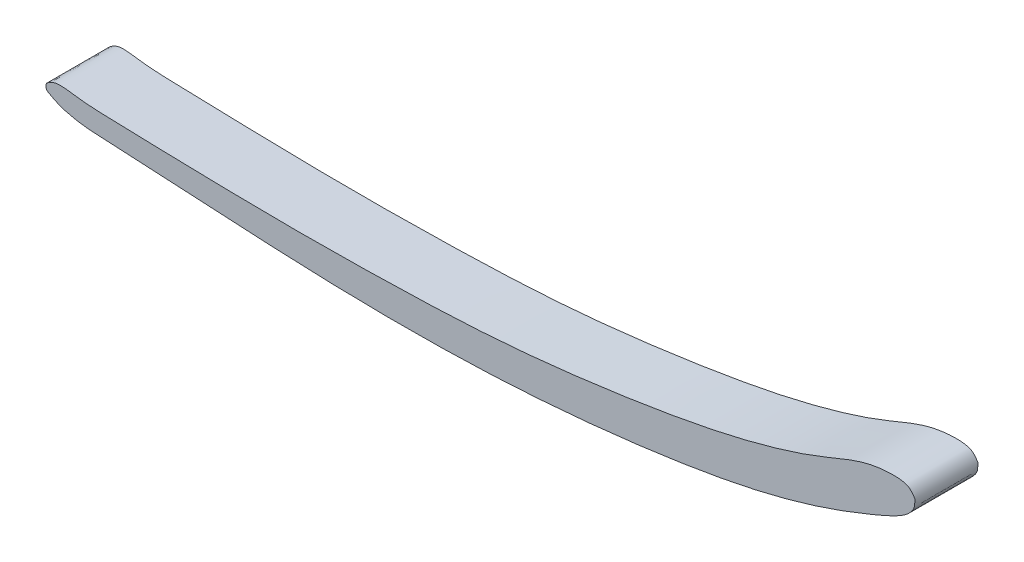
ISO-10303-21;
HEADER;
FILE_DESCRIPTION(('STEP AP214'),'2;1');
FILE_NAME('part.step','',(''),(''),'','','');
FILE_SCHEMA(('AUTOMOTIVE_DESIGN { 1 0 10303 214 1 1 1 1 }'));
ENDSEC;
DATA;
#1=APPLICATION_CONTEXT('core data for automotive mechanical design processes');
#2=APPLICATION_PROTOCOL_DEFINITION('international standard','automotive_design',2000,#1);
#3=PRODUCT_CONTEXT('',#1,'mechanical');
#4=PRODUCT('Part','Part','',(#3));
#5=PRODUCT_RELATED_PRODUCT_CATEGORY('part','',(#4));
#6=PRODUCT_DEFINITION_FORMATION('','',#4);
#7=PRODUCT_DEFINITION_CONTEXT('part definition',#1,'design');
#8=PRODUCT_DEFINITION('design','',#6,#7);
#9=PRODUCT_DEFINITION_SHAPE('','',#8);
#10=(LENGTH_UNIT() NAMED_UNIT(*) SI_UNIT(.MILLI.,.METRE.));
#11=(NAMED_UNIT(*) PLANE_ANGLE_UNIT() SI_UNIT($,.RADIAN.));
#12=(NAMED_UNIT(*) SI_UNIT($,.STERADIAN.) SOLID_ANGLE_UNIT());
#13=UNCERTAINTY_MEASURE_WITH_UNIT(LENGTH_MEASURE(1.E-05),#10,'distance_accuracy_value','');
#14=(GEOMETRIC_REPRESENTATION_CONTEXT(3) GLOBAL_UNCERTAINTY_ASSIGNED_CONTEXT((#13)) GLOBAL_UNIT_ASSIGNED_CONTEXT((#10,
#11,#12)) REPRESENTATION_CONTEXT('',''));
#15=CARTESIAN_POINT('',(0.,0.,0.));
#16=DIRECTION('',(0.,0.,1.));
#17=DIRECTION('',(1.,0.,0.));
#18=AXIS2_PLACEMENT_3D('',#15,#16,#17);
#19=CARTESIAN_POINT('',(44.0644998100804,0.,468.));
#20=CARTESIAN_POINT('',(44.0487426110995,0.0747795698248371,468.));
#21=CARTESIAN_POINT('',(44.0066285616688,0.138285887827466,468.));
#22=CARTESIAN_POINT('',(43.9174798611695,0.259771016666507,468.));
#23=CARTESIAN_POINT('',(43.8693396593438,0.317704629409471,468.));
#24=CARTESIAN_POINT('',(43.728705510161,0.494488197718357,468.));
#25=CARTESIAN_POINT('',(43.6355314167215,0.614036978815527,468.));
#26=CARTESIAN_POINT('',(43.4776854036437,0.773364463677331,468.));
#27=CARTESIAN_POINT('',(43.4224494251973,0.823355589215966,468.));
#28=CARTESIAN_POINT('',(43.3028584150423,0.912487998679615,468.));
#29=CARTESIAN_POINT('',(43.2383813507814,0.952187287814169,468.));
#30=CARTESIAN_POINT('',(43.036491469862,1.05648348796587,468.));
#31=CARTESIAN_POINT('',(42.8949440843003,1.10489769444441,468.));
#32=CARTESIAN_POINT('',(42.6051946924935,1.18151899478794,468.));
#33=CARTESIAN_POINT('',(42.4563249647608,1.20911279913936,468.));
#34=CARTESIAN_POINT('',(42.1599701086323,1.25263575074508,468.));
#35=CARTESIAN_POINT('',(42.0116678309176,1.26825994903046,468.));
#36=CARTESIAN_POINT('',(41.5664336996111,1.29904343475046,468.));
#37=CARTESIAN_POINT('',(41.2692052946623,1.29962504440216,468.));
#38=CARTESIAN_POINT('',(40.3769537596533,1.27353107694493,468.));
#39=CARTESIAN_POINT('',(39.7793953379146,1.21326251019017,468.));
#40=CARTESIAN_POINT('',(38.6093345703275,1.02800174316137,468.));
#41=CARTESIAN_POINT('',(38.033877553265,0.900526481156141,468.));
#42=CARTESIAN_POINT('',(36.3342386903471,0.420801607137103,468.));
#43=CARTESIAN_POINT('',(35.2343480996498,-0.0204449536766182,468.));
#44=CARTESIAN_POINT('',(33.0397157547789,-0.91902635895362,468.));
#45=CARTESIAN_POINT('',(31.941817983729,-1.36653330914031,468.));
#46=CARTESIAN_POINT('',(29.7194733442159,-2.18012160701367,468.));
#47=CARTESIAN_POINT('',(28.5963648598515,-2.55030775457044,468.));
#48=CARTESIAN_POINT('',(26.334191646651,-3.24174253593278,468.));
#49=CARTESIAN_POINT('',(25.1951322618297,-3.56300755973495,468.));
#50=CARTESIAN_POINT('',(22.9049128626524,-4.16842519499815,468.));
#51=CARTESIAN_POINT('',(21.7528308604324,-4.4517038220054,468.));
#52=CARTESIAN_POINT('',(19.441266107108,-4.98035279634867,468.));
#53=CARTESIAN_POINT('',(18.2815119485901,-5.2261292514405,468.));
#54=CARTESIAN_POINT('',(14.7928225700587,-5.9194354288372,468.));
#55=CARTESIAN_POINT('',(12.4559665401192,-6.32497870535333,468.));
#56=CARTESIAN_POINT('',(7.77368696752906,-7.06949517634928,468.));
#57=CARTESIAN_POINT('',(5.42689105443257,-7.40552729274606,468.));
#58=CARTESIAN_POINT('',(0.723827305647878,-8.01692616071034,468.));
#59=CARTESIAN_POINT('',(-1.63103770718041,-8.29207792652546,468.));
#60=CARTESIAN_POINT('',(-6.34870595525171,-8.75984581041182,468.));
#61=CARTESIAN_POINT('',(-8.7121917654114,-8.95173173202739,468.));
#62=CARTESIAN_POINT('',(-13.4455415840817,-9.2505778596734,468.));
#63=CARTESIAN_POINT('',(-15.8139411499019,-9.35849633448876,468.));
#64=CARTESIAN_POINT('',(-20.5527711504375,-9.52545956372952,468.));
#65=CARTESIAN_POINT('',(-22.9233067662587,-9.58612766573032,468.));
#66=CARTESIAN_POINT('',(-27.6646911517423,-9.67727732300758,468.));
#67=CARTESIAN_POINT('',(-30.0355398040244,-9.70636359756674,468.));
#68=CARTESIAN_POINT('',(-34.7776012275624,-9.72616331640817,468.));
#69=CARTESIAN_POINT('',(-37.1489474895554,-9.71485439545976,468.));
#70=CARTESIAN_POINT('',(-41.8910401710544,-9.65628801843245,468.));
#71=CARTESIAN_POINT('',(-44.2618828820648,-9.60941579762635,468.));
#72=CARTESIAN_POINT('',(-49.003169415494,-9.50055554065823,468.));
#73=CARTESIAN_POINT('',(-51.3736681314817,-9.4399019462786,468.));
#74=CARTESIAN_POINT('',(-54.9292293004791,-9.34226904286155,468.));
#75=CARTESIAN_POINT('',(-56.1143760307127,-9.3081641940089,468.));
#76=CARTESIAN_POINT('',(-57.8919124120678,-9.25120870961037,468.));
#77=CARTESIAN_POINT('',(-58.4844769231578,-9.23383337513604,468.));
#78=CARTESIAN_POINT('',(-59.6693025708144,-9.18975961592779,468.));
#79=CARTESIAN_POINT('',(-60.261368540667,-9.1623658838923,468.));
#80=CARTESIAN_POINT('',(-61.4424121592727,-9.07472662624309,468.));
#81=CARTESIAN_POINT('',(-62.0312424161992,-9.01215760276729,468.));
#82=CARTESIAN_POINT('',(-62.9120040645428,-8.89077399119345,468.));
#83=CARTESIAN_POINT('',(-63.2052490654777,-8.84538030283788,468.));
#84=CARTESIAN_POINT('',(-63.7930483140101,-8.77582879977123,468.));
#85=CARTESIAN_POINT('',(-64.0873647970197,-8.74877982399833,468.));
#86=CARTESIAN_POINT('',(-64.6788990580981,-8.74845945706004,468.));
#87=CARTESIAN_POINT('',(-64.9801997791766,-8.77849470570007,468.));
#88=CARTESIAN_POINT('',(-65.3976771033837,-8.925670090988,468.));
#89=CARTESIAN_POINT('',(-65.5328364388672,-8.99117678064817,468.));
#90=CARTESIAN_POINT('',(-65.7291426050438,-9.09918990449302,468.));
#91=CARTESIAN_POINT('',(-65.7933724927479,-9.13733044947888,468.));
#92=CARTESIAN_POINT('',(-65.9206201421513,-9.21575944941545,468.));
#93=CARTESIAN_POINT('',(-65.9856460833711,-9.2529717847841,468.));
#94=CARTESIAN_POINT('',(-66.074863422471,-9.32109150036592,468.));
#95=CARTESIAN_POINT('',(-66.1026083662393,-9.34647422907237,468.));
#96=CARTESIAN_POINT('',(-66.1484221414977,-9.40481990969558,468.));
#97=CARTESIAN_POINT('',(-66.167159046373,-9.43798284004486,468.));
#98=CARTESIAN_POINT('',(-66.2088132969872,-9.54135023052961,468.));
#99=CARTESIAN_POINT('',(-66.2156651510359,-9.61733383106155,468.));
#100=CARTESIAN_POINT('',(-66.2107615171826,-9.76585735092438,468.));
#101=CARTESIAN_POINT('',(-66.2050718671693,-9.84037523842224,468.));
#102=CARTESIAN_POINT('',(-66.1807072701507,-9.98723272681659,468.));
#103=CARTESIAN_POINT('',(-66.1601257950063,-10.0607991888009,468.));
#104=CARTESIAN_POINT('',(-66.0793201734134,-10.1856961165474,468.));
#105=CARTESIAN_POINT('',(-66.0170726552108,-10.2305771423296,468.));
#106=CARTESIAN_POINT('',(-65.888800740335,-10.3017982432044,468.));
#107=CARTESIAN_POINT('',(-65.8213839416174,-10.3313729613084,468.));
#108=CARTESIAN_POINT('',(-65.6237594448957,-10.4286074795716,468.));
#109=CARTESIAN_POINT('',(-65.4953569436119,-10.4998263598811,468.));
#110=CARTESIAN_POINT('',(-65.2381862950858,-10.6422594866561,468.));
#111=CARTESIAN_POINT('',(-65.1095860122687,-10.7134428846287,468.));
#112=CARTESIAN_POINT('',(-64.846459335005,-10.8426705797111,468.));
#113=CARTESIAN_POINT('',(-64.712261855566,-10.9014441319764,468.));
#114=CARTESIAN_POINT('',(-64.3034957414497,-11.0640768000721,468.));
#115=CARTESIAN_POINT('',(-64.0223781539809,-11.1550521074748,468.));
#116=CARTESIAN_POINT('',(-63.1730985507133,-11.3996615053087,468.));
#117=CARTESIAN_POINT('',(-62.5959128417318,-11.5222449558475,468.));
#118=CARTESIAN_POINT('',(-61.4323686414119,-11.70477149075,468.));
#119=CARTESIAN_POINT('',(-60.8484402188233,-11.7657324686755,468.));
#120=CARTESIAN_POINT('',(-59.6788127267434,-11.8627719420278,468.));
#121=CARTESIAN_POINT('',(-59.0930490284576,-11.897942224278,468.));
#122=CARTESIAN_POINT('',(-57.3347133821027,-11.9887742356761,468.));
#123=CARTESIAN_POINT('',(-56.1613588489297,-12.033353064341,468.));
#124=CARTESIAN_POINT('',(-53.81554554101,-12.1354506914092,468.));
#125=CARTESIAN_POINT('',(-52.6428559320847,-12.1907703526045,468.));
#126=CARTESIAN_POINT('',(-49.1255823407132,-12.3723773756695,468.));
#127=CARTESIAN_POINT('',(-46.7815967097742,-12.5104214073786,468.));
#128=CARTESIAN_POINT('',(-42.093316174935,-12.7803722092456,468.));
#129=CARTESIAN_POINT('',(-39.7488668148183,-12.9093878563781,468.));
#130=CARTESIAN_POINT('',(-35.0581422317833,-13.1322138776901,468.));
#131=CARTESIAN_POINT('',(-32.711704686276,-13.2272005070115,468.));
#132=CARTESIAN_POINT('',(-28.0181934424292,-13.3680667852679,468.));
#133=CARTESIAN_POINT('',(-25.6710023360616,-13.4143485234218,468.));
#134=CARTESIAN_POINT('',(-18.6279495251887,-13.4711430482395,468.));
#135=CARTESIAN_POINT('',(-13.9310592084294,-13.3960026998435,468.));
#136=CARTESIAN_POINT('',(-6.89620119401808,-13.0653513837359,468.));
#137=CARTESIAN_POINT('',(-4.5519084242352,-12.9169010107629,468.));
#138=CARTESIAN_POINT('',(0.129380000783136,-12.5513379467449,468.));
#139=CARTESIAN_POINT('',(2.46672003829808,-12.3341029576614,468.));
#140=CARTESIAN_POINT('',(7.13460455537941,-11.828774001234,468.));
#141=CARTESIAN_POINT('',(9.46623197321021,-11.5429036821514,468.));
#142=CARTESIAN_POINT('',(14.1161937681737,-10.8939622181808,468.));
#143=CARTESIAN_POINT('',(16.4350946329209,-10.5328539414953,468.));
#144=CARTESIAN_POINT('',(21.0544395176363,-9.69941866527703,468.));
#145=CARTESIAN_POINT('',(23.3572213856599,-9.22631232236966,468.));
#146=CARTESIAN_POINT('',(27.9196732280383,-8.11317220995275,468.));
#147=CARTESIAN_POINT('',(30.181288228683,-7.47103725833653,468.));
#148=CARTESIAN_POINT('',(34.6403757700239,-5.99263668056362,468.));
#149=CARTESIAN_POINT('',(36.8382836012823,-5.15648057027124,468.));
#150=CARTESIAN_POINT('',(39.5466722234027,-4.02015176182585,468.));
#151=CARTESIAN_POINT('',(40.0865160543014,-3.78839939866528,468.));
#152=CARTESIAN_POINT('',(40.8881445287564,-3.42243310524981,468.));
#153=CARTESIAN_POINT('',(41.1535725721356,-3.29684727771964,468.));
#154=CARTESIAN_POINT('',(41.6781754043687,-3.033049180848,468.));
#155=CARTESIAN_POINT('',(41.9382991947852,-2.8950787501591,468.));
#156=CARTESIAN_POINT('',(42.4428637720376,-2.59670619542955,468.));
#157=CARTESIAN_POINT('',(42.6871175776959,-2.43654590744033,468.));
#158=CARTESIAN_POINT('',(43.0332218728056,-2.16858995600915,468.));
#159=CARTESIAN_POINT('',(43.1451075862784,-2.07451128685697,468.));
#160=CARTESIAN_POINT('',(43.3594659160693,-1.87348732996533,468.));
#161=CARTESIAN_POINT('',(43.4622438782328,-1.76588074499226,468.));
#162=CARTESIAN_POINT('',(43.6524470584674,-1.54034888322031,468.));
#163=CARTESIAN_POINT('',(43.7403607821456,-1.42207640564945,468.));
#164=CARTESIAN_POINT('',(43.8911371023551,-1.16634005312835,468.));
#165=CARTESIAN_POINT('',(43.9525297856029,-1.03201294871684,468.));
#166=CARTESIAN_POINT('',(44.0234137328401,-0.74607381967709,468.));
#167=CARTESIAN_POINT('',(44.0303835377685,-0.594926739972731,468.));
#168=CARTESIAN_POINT('',(44.0436056617194,-0.371858371836675,468.));
#169=CARTESIAN_POINT('',(44.0513004781616,-0.297725948045904,468.));
#170=CARTESIAN_POINT('',(44.0684380761984,-0.149580043382072,468.));
#171=CARTESIAN_POINT('',(44.0802570090613,-0.0747795698248233,468.));
#172=CARTESIAN_POINT('',(44.0644998100804,0.,468.));
#173=B_SPLINE_CURVE_WITH_KNOTS('',3,(#19,#20,#21,#22,#23,#24,#25,#26,#27,#28,#29,#30,#31,#32,
#33,#34,#35,#36,#37,#38,#39,#40,#41,#42,#43,#44,#45,#46,#47,#48,#49,#50,#51,#52,#53,#54,#55,#56,
#57,#58,#59,#60,#61,#62,#63,#64,#65,#66,#67,#68,#69,#70,#71,#72,#73,#74,#75,#76,#77,#78,#79,#80,
#81,#82,#83,#84,#85,#86,#87,#88,#89,#90,#91,#92,#93,#94,#95,#96,#97,#98,#99,#100,#101,#102,#103,
#104,#105,#106,#107,#108,#109,#110,#111,#112,#113,#114,#115,#116,#117,#118,#119,#120,#121,#122,
#123,#124,#125,#126,#127,#128,#129,#130,#131,#132,#133,#134,#135,#136,#137,#138,#139,#140,#141,
#142,#143,#144,#145,#146,#147,#148,#149,#150,#151,#152,#153,#154,#155,#156,#157,#158,#159,#160,
#161,#162,#163,#164,#165,#166,#167,#168,#169,#170,#171,#172),.UNSPECIFIED.,.T.,.F.,(4,2,2,2,2,2,
2,2,2,2,2,2,2,2,2,2,2,2,2,2,2,2,2,2,2,2,2,2,2,2,2,2,2,2,2,2,2,2,2,2,2,2,2,2,2,2,2,2,2,2,2,2,2,2,
2,2,2,2,2,2,2,2,2,2,2,2,2,2,2,2,2,2,2,2,2,2,4),(0.,0.000976562500000071,0.00195312500000014,
0.00390625000000023,0.00488281250000027,0.00585937500000031,0.0078125000000004,
0.00976562500000049,0.0117187500000006,0.0156250000000007,0.0234375000000011,0.0312500000000014,
0.0468750000000021,0.0625000000000028,0.0781250000000035,0.0937500000000042,0.109375000000005,
0.125000000000006,0.156250000000007,0.187500000000008,0.21875000000001,0.250000000000011,
0.281250000000013,0.312500000000014,0.343750000000015,0.375000000000017,0.406250000000018,
0.43750000000002,0.45312500000002,0.460937500000021,0.468750000000021,0.476562500000021,
0.480468750000021,0.484375000000022,0.488281250000022,0.490234375000022,0.491210937500022,
0.492187500000022,0.492675781250022,0.493164062500022,0.494140625000021,0.495117187500021,
0.496093750000021,0.497070312500021,0.498046875000021,0.500000000000021,0.501953125000021,
0.503906250000021,0.507812500000021,0.51562500000002,0.52343750000002,0.53125000000002,
0.546875000000019,0.562500000000019,0.593750000000017,0.625000000000016,0.656250000000014,
0.687500000000013,0.75000000000001,0.781250000000009,0.812500000000008,0.843750000000007,
0.875000000000005,0.906250000000004,0.937500000000003,0.968750000000001,0.976562500000001,
0.980468750000001,0.984375000000001,0.988281250000001,0.990234375000001,0.9921875,0.994140625,
0.99609375,0.998046875,0.9990234375,1.),.UNSPECIFIED.);
#174=DIRECTION('',(0.,0.,-1.));
#175=VECTOR('',#174,1.);
#176=SURFACE_OF_LINEAR_EXTRUSION('',#173,#175);
#177=CARTESIAN_POINT('',(44.0644998100804,0.,468.));
#178=CARTESIAN_POINT('',(44.0802570090613,-0.0747795698248233,468.));
#179=CARTESIAN_POINT('',(44.0684380761984,-0.149580043382072,468.));
#180=CARTESIAN_POINT('',(44.0513004781616,-0.297725948045904,468.));
#181=CARTESIAN_POINT('',(44.0436056617194,-0.371858371836675,468.));
#182=CARTESIAN_POINT('',(44.0303835377685,-0.594926739972731,468.));
#183=CARTESIAN_POINT('',(44.0234137328401,-0.74607381967709,468.));
#184=CARTESIAN_POINT('',(43.9525297856029,-1.03201294871684,468.));
#185=CARTESIAN_POINT('',(43.8911371023551,-1.16634005312835,468.));
#186=CARTESIAN_POINT('',(43.7403607821456,-1.42207640564945,468.));
#187=CARTESIAN_POINT('',(43.6524470584674,-1.54034888322031,468.));
#188=CARTESIAN_POINT('',(43.4622438782328,-1.76588074499226,468.));
#189=CARTESIAN_POINT('',(43.3594659160693,-1.87348732996533,468.));
#190=CARTESIAN_POINT('',(43.1451075862784,-2.07451128685697,468.));
#191=CARTESIAN_POINT('',(43.0332218728056,-2.16858995600915,468.));
#192=CARTESIAN_POINT('',(42.6871175776959,-2.43654590744033,468.));
#193=CARTESIAN_POINT('',(42.4428637720376,-2.59670619542955,468.));
#194=CARTESIAN_POINT('',(41.9382991947852,-2.8950787501591,468.));
#195=CARTESIAN_POINT('',(41.6781754043687,-3.033049180848,468.));
#196=CARTESIAN_POINT('',(41.1535725721356,-3.29684727771964,468.));
#197=CARTESIAN_POINT('',(40.8881445287564,-3.42243310524981,468.));
#198=CARTESIAN_POINT('',(40.0865160543014,-3.78839939866528,468.));
#199=CARTESIAN_POINT('',(39.5466722234027,-4.02015176182585,468.));
#200=CARTESIAN_POINT('',(36.8382836012823,-5.15648057027124,468.));
#201=CARTESIAN_POINT('',(34.6403757700239,-5.99263668056362,468.));
#202=CARTESIAN_POINT('',(30.181288228683,-7.47103725833653,468.));
#203=CARTESIAN_POINT('',(27.9196732280383,-8.11317220995275,468.));
#204=CARTESIAN_POINT('',(23.3572213856599,-9.22631232236966,468.));
#205=CARTESIAN_POINT('',(21.0544395176363,-9.69941866527703,468.));
#206=CARTESIAN_POINT('',(16.4350946329209,-10.5328539414953,468.));
#207=CARTESIAN_POINT('',(14.1161937681737,-10.8939622181808,468.));
#208=CARTESIAN_POINT('',(9.46623197321021,-11.5429036821514,468.));
#209=CARTESIAN_POINT('',(7.13460455537941,-11.828774001234,468.));
#210=CARTESIAN_POINT('',(2.46672003829808,-12.3341029576614,468.));
#211=CARTESIAN_POINT('',(0.129380000783136,-12.5513379467449,468.));
#212=CARTESIAN_POINT('',(-4.5519084242352,-12.9169010107629,468.));
#213=CARTESIAN_POINT('',(-6.89620119401808,-13.0653513837359,468.));
#214=CARTESIAN_POINT('',(-13.9310592084294,-13.3960026998435,468.));
#215=CARTESIAN_POINT('',(-18.6279495251887,-13.4711430482395,468.));
#216=CARTESIAN_POINT('',(-25.6710023360616,-13.4143485234218,468.));
#217=CARTESIAN_POINT('',(-28.0181934424292,-13.3680667852679,468.));
#218=CARTESIAN_POINT('',(-32.711704686276,-13.2272005070115,468.));
#219=CARTESIAN_POINT('',(-35.0581422317833,-13.1322138776901,468.));
#220=CARTESIAN_POINT('',(-39.7488668148183,-12.9093878563781,468.));
#221=CARTESIAN_POINT('',(-42.093316174935,-12.7803722092456,468.));
#222=CARTESIAN_POINT('',(-46.7815967097742,-12.5104214073786,468.));
#223=CARTESIAN_POINT('',(-49.1255823407132,-12.3723773756695,468.));
#224=CARTESIAN_POINT('',(-52.6428559320847,-12.1907703526045,468.));
#225=CARTESIAN_POINT('',(-53.81554554101,-12.1354506914092,468.));
#226=CARTESIAN_POINT('',(-56.1613588489297,-12.033353064341,468.));
#227=CARTESIAN_POINT('',(-57.3347133821027,-11.9887742356761,468.));
#228=CARTESIAN_POINT('',(-59.0930490284576,-11.897942224278,468.));
#229=CARTESIAN_POINT('',(-59.6788127267434,-11.8627719420278,468.));
#230=CARTESIAN_POINT('',(-60.8484402188233,-11.7657324686755,468.));
#231=CARTESIAN_POINT('',(-61.4323686414119,-11.70477149075,468.));
#232=CARTESIAN_POINT('',(-62.5959128417318,-11.5222449558475,468.));
#233=CARTESIAN_POINT('',(-63.1730985507133,-11.3996615053087,468.));
#234=CARTESIAN_POINT('',(-64.0223781539809,-11.1550521074748,468.));
#235=CARTESIAN_POINT('',(-64.3034957414497,-11.0640768000721,468.));
#236=CARTESIAN_POINT('',(-64.712261855566,-10.9014441319764,468.));
#237=CARTESIAN_POINT('',(-64.846459335005,-10.8426705797111,468.));
#238=CARTESIAN_POINT('',(-65.1095860122687,-10.7134428846287,468.));
#239=CARTESIAN_POINT('',(-65.2381862950858,-10.6422594866561,468.));
#240=CARTESIAN_POINT('',(-65.4953569436119,-10.4998263598811,468.));
#241=CARTESIAN_POINT('',(-65.6237594448957,-10.4286074795716,468.));
#242=CARTESIAN_POINT('',(-65.8213839416174,-10.3313729613084,468.));
#243=CARTESIAN_POINT('',(-65.888800740335,-10.3017982432044,468.));
#244=CARTESIAN_POINT('',(-66.0170726552108,-10.2305771423296,468.));
#245=CARTESIAN_POINT('',(-66.0793201734134,-10.1856961165474,468.));
#246=CARTESIAN_POINT('',(-66.1601257950063,-10.0607991888009,468.));
#247=CARTESIAN_POINT('',(-66.1807072701507,-9.98723272681659,468.));
#248=CARTESIAN_POINT('',(-66.2050718671693,-9.84037523842224,468.));
#249=CARTESIAN_POINT('',(-66.2107615171826,-9.76585735092438,468.));
#250=CARTESIAN_POINT('',(-66.2156651510359,-9.61733383106155,468.));
#251=CARTESIAN_POINT('',(-66.2088132969872,-9.54135023052961,468.));
#252=CARTESIAN_POINT('',(-66.167159046373,-9.43798284004486,468.));
#253=CARTESIAN_POINT('',(-66.1484221414977,-9.40481990969558,468.));
#254=CARTESIAN_POINT('',(-66.1026083662393,-9.34647422907237,468.));
#255=CARTESIAN_POINT('',(-66.074863422471,-9.32109150036592,468.));
#256=CARTESIAN_POINT('',(-65.9856460833711,-9.2529717847841,468.));
#257=CARTESIAN_POINT('',(-65.9206201421513,-9.21575944941545,468.));
#258=CARTESIAN_POINT('',(-65.7933724927479,-9.13733044947888,468.));
#259=CARTESIAN_POINT('',(-65.7291426050438,-9.09918990449302,468.));
#260=CARTESIAN_POINT('',(-65.5328364388672,-8.99117678064817,468.));
#261=CARTESIAN_POINT('',(-65.3976771033837,-8.925670090988,468.));
#262=CARTESIAN_POINT('',(-64.9801997791766,-8.77849470570007,468.));
#263=CARTESIAN_POINT('',(-64.6788990580981,-8.74845945706004,468.));
#264=CARTESIAN_POINT('',(-64.0873647970197,-8.74877982399833,468.));
#265=CARTESIAN_POINT('',(-63.7930483140101,-8.77582879977123,468.));
#266=CARTESIAN_POINT('',(-63.2052490654777,-8.84538030283788,468.));
#267=CARTESIAN_POINT('',(-62.9120040645428,-8.89077399119345,468.));
#268=CARTESIAN_POINT('',(-62.0312424161992,-9.01215760276729,468.));
#269=CARTESIAN_POINT('',(-61.4424121592727,-9.07472662624309,468.));
#270=CARTESIAN_POINT('',(-60.261368540667,-9.1623658838923,468.));
#271=CARTESIAN_POINT('',(-59.6693025708144,-9.18975961592779,468.));
#272=CARTESIAN_POINT('',(-58.4844769231578,-9.23383337513604,468.));
#273=CARTESIAN_POINT('',(-57.8919124120678,-9.25120870961037,468.));
#274=CARTESIAN_POINT('',(-56.1143760307127,-9.3081641940089,468.));
#275=CARTESIAN_POINT('',(-54.9292293004791,-9.34226904286155,468.));
#276=CARTESIAN_POINT('',(-51.3736681314817,-9.4399019462786,468.));
#277=CARTESIAN_POINT('',(-49.003169415494,-9.50055554065823,468.));
#278=CARTESIAN_POINT('',(-44.2618828820648,-9.60941579762635,468.));
#279=CARTESIAN_POINT('',(-41.8910401710544,-9.65628801843245,468.));
#280=CARTESIAN_POINT('',(-37.1489474895554,-9.71485439545976,468.));
#281=CARTESIAN_POINT('',(-34.7776012275624,-9.72616331640817,468.));
#282=CARTESIAN_POINT('',(-30.0355398040244,-9.70636359756674,468.));
#283=CARTESIAN_POINT('',(-27.6646911517423,-9.67727732300758,468.));
#284=CARTESIAN_POINT('',(-22.9233067662587,-9.58612766573032,468.));
#285=CARTESIAN_POINT('',(-20.5527711504375,-9.52545956372952,468.));
#286=CARTESIAN_POINT('',(-15.8139411499019,-9.35849633448876,468.));
#287=CARTESIAN_POINT('',(-13.4455415840817,-9.2505778596734,468.));
#288=CARTESIAN_POINT('',(-8.7121917654114,-8.95173173202739,468.));
#289=CARTESIAN_POINT('',(-6.34870595525171,-8.75984581041182,468.));
#290=CARTESIAN_POINT('',(-1.63103770718041,-8.29207792652546,468.));
#291=CARTESIAN_POINT('',(0.723827305647878,-8.01692616071034,468.));
#292=CARTESIAN_POINT('',(5.42689105443257,-7.40552729274606,468.));
#293=CARTESIAN_POINT('',(7.77368696752906,-7.06949517634928,468.));
#294=CARTESIAN_POINT('',(12.4559665401192,-6.32497870535333,468.));
#295=CARTESIAN_POINT('',(14.7928225700587,-5.9194354288372,468.));
#296=CARTESIAN_POINT('',(18.2815119485901,-5.2261292514405,468.));
#297=CARTESIAN_POINT('',(19.441266107108,-4.98035279634867,468.));
#298=CARTESIAN_POINT('',(21.7528308604324,-4.4517038220054,468.));
#299=CARTESIAN_POINT('',(22.9049128626524,-4.16842519499815,468.));
#300=CARTESIAN_POINT('',(25.1951322618297,-3.56300755973495,468.));
#301=CARTESIAN_POINT('',(26.334191646651,-3.24174253593278,468.));
#302=CARTESIAN_POINT('',(28.5963648598515,-2.55030775457044,468.));
#303=CARTESIAN_POINT('',(29.7194733442159,-2.18012160701367,468.));
#304=CARTESIAN_POINT('',(31.941817983729,-1.36653330914031,468.));
#305=CARTESIAN_POINT('',(33.0397157547789,-0.91902635895362,468.));
#306=CARTESIAN_POINT('',(35.2343480996498,-0.0204449536766182,468.));
#307=CARTESIAN_POINT('',(36.3342386903471,0.420801607137103,468.));
#308=CARTESIAN_POINT('',(38.033877553265,0.900526481156141,468.));
#309=CARTESIAN_POINT('',(38.6093345703275,1.02800174316137,468.));
#310=CARTESIAN_POINT('',(39.7793953379146,1.21326251019017,468.));
#311=CARTESIAN_POINT('',(40.3769537596533,1.27353107694493,468.));
#312=CARTESIAN_POINT('',(41.2692052946623,1.29962504440216,468.));
#313=CARTESIAN_POINT('',(41.5664336996111,1.29904343475046,468.));
#314=CARTESIAN_POINT('',(42.0116678309176,1.26825994903046,468.));
#315=CARTESIAN_POINT('',(42.1599701086323,1.25263575074508,468.));
#316=CARTESIAN_POINT('',(42.4563249647608,1.20911279913936,468.));
#317=CARTESIAN_POINT('',(42.6051946924935,1.18151899478794,468.));
#318=CARTESIAN_POINT('',(42.8949440843003,1.10489769444441,468.));
#319=CARTESIAN_POINT('',(43.036491469862,1.05648348796587,468.));
#320=CARTESIAN_POINT('',(43.2383813507814,0.952187287814169,468.));
#321=CARTESIAN_POINT('',(43.3028584150423,0.912487998679615,468.));
#322=CARTESIAN_POINT('',(43.4224494251973,0.823355589215966,468.));
#323=CARTESIAN_POINT('',(43.4776854036437,0.773364463677331,468.));
#324=CARTESIAN_POINT('',(43.6355314167215,0.614036978815527,468.));
#325=CARTESIAN_POINT('',(43.728705510161,0.494488197718357,468.));
#326=CARTESIAN_POINT('',(43.8693396593438,0.317704629409471,468.));
#327=CARTESIAN_POINT('',(43.9174798611695,0.259771016666507,468.));
#328=CARTESIAN_POINT('',(44.0066285616688,0.138285887827466,468.));
#329=CARTESIAN_POINT('',(44.0487426110995,0.0747795698248371,468.));
#330=CARTESIAN_POINT('',(44.0644998100804,0.,468.));
#331=B_SPLINE_CURVE_WITH_KNOTS('',3,(#177,#178,#179,#180,#181,#182,#183,#184,#185,#186,#187,
#188,#189,#190,#191,#192,#193,#194,#195,#196,#197,#198,#199,#200,#201,#202,#203,#204,#205,#206,
#207,#208,#209,#210,#211,#212,#213,#214,#215,#216,#217,#218,#219,#220,#221,#222,#223,#224,#225,
#226,#227,#228,#229,#230,#231,#232,#233,#234,#235,#236,#237,#238,#239,#240,#241,#242,#243,#244,
#245,#246,#247,#248,#249,#250,#251,#252,#253,#254,#255,#256,#257,#258,#259,#260,#261,#262,#263,
#264,#265,#266,#267,#268,#269,#270,#271,#272,#273,#274,#275,#276,#277,#278,#279,#280,#281,#282,
#283,#284,#285,#286,#287,#288,#289,#290,#291,#292,#293,#294,#295,#296,#297,#298,#299,#300,#301,
#302,#303,#304,#305,#306,#307,#308,#309,#310,#311,#312,#313,#314,#315,#316,#317,#318,#319,#320,
#321,#322,#323,#324,#325,#326,#327,#328,#329,#330),.UNSPECIFIED.,.T.,.F.,(4,2,2,2,2,2,2,2,2,2,2,
2,2,2,2,2,2,2,2,2,2,2,2,2,2,2,2,2,2,2,2,2,2,2,2,2,2,2,2,2,2,2,2,2,2,2,2,2,2,2,2,2,2,2,2,2,2,2,2,
2,2,2,2,2,2,2,2,2,2,2,2,2,2,2,2,2,4),(0.,0.000976562499999889,0.00195312499999978,
0.00390624999999978,0.00585937499999967,0.00781249999999956,0.00976562499999944,
0.0117187499999994,0.0156249999999992,0.0195312499999991,0.0234374999999989,0.0312499999999986,
0.0624999999999973,0.093749999999996,0.124999999999995,0.156249999999993,0.187499999999992,
0.218749999999991,0.24999999999999,0.312499999999987,0.343749999999986,0.374999999999984,
0.406249999999983,0.437499999999981,0.453124999999981,0.46874999999998,0.47656249999998,
0.48437499999998,0.492187499999979,0.496093749999979,0.498046874999979,0.499999999999979,
0.501953124999979,0.502929687499979,0.503906249999979,0.504882812499978,0.505859374999978,
0.506835937499978,0.507324218749978,0.507812499999978,0.508789062499978,0.509765624999978,
0.511718749999978,0.515624999999978,0.519531249999979,0.523437499999979,0.531249999999979,
0.539062499999979,0.54687499999998,0.56249999999998,0.593749999999982,0.624999999999983,
0.656249999999984,0.687499999999986,0.718749999999987,0.749999999999989,0.78124999999999,
0.812499999999992,0.843749999999993,0.874999999999994,0.890624999999995,0.906249999999996,
0.921874999999997,0.937499999999997,0.953124999999998,0.968749999999999,0.976562499999999,
0.984374999999999,0.988281249999999,0.990234375,0.9921875,0.994140625,0.9951171875,0.99609375,
0.998046875,0.9990234375,1.),.UNSPECIFIED.);
#332=CARTESIAN_POINT('',(44.0644998100804,0.,468.));
#333=VERTEX_POINT('',#332);
#334=EDGE_CURVE('E10',#333,#333,#331,.F.);
#335=ORIENTED_EDGE('',*,*,#334,.F.);
#336=EDGE_LOOP('',(#335));
#337=FACE_BOUND('',#336,.T.);
#338=CARTESIAN_POINT('',(44.0644998100804,0.,460.));
#339=CARTESIAN_POINT('',(44.0487426110995,0.0747795698248371,460.));
#340=CARTESIAN_POINT('',(44.0066285616688,0.138285887827466,460.));
#341=CARTESIAN_POINT('',(43.9174798611695,0.259771016666507,460.));
#342=CARTESIAN_POINT('',(43.8693396593438,0.317704629409471,460.));
#343=CARTESIAN_POINT('',(43.728705510161,0.494488197718357,460.));
#344=CARTESIAN_POINT('',(43.6355314167215,0.614036978815527,460.));
#345=CARTESIAN_POINT('',(43.4776854036437,0.773364463677331,460.));
#346=CARTESIAN_POINT('',(43.4224494251973,0.823355589215966,460.));
#347=CARTESIAN_POINT('',(43.3028584150423,0.912487998679615,460.));
#348=CARTESIAN_POINT('',(43.2383813507814,0.952187287814169,460.));
#349=CARTESIAN_POINT('',(43.036491469862,1.05648348796587,460.));
#350=CARTESIAN_POINT('',(42.8949440843003,1.10489769444441,460.));
#351=CARTESIAN_POINT('',(42.6051946924935,1.18151899478794,460.));
#352=CARTESIAN_POINT('',(42.4563249647608,1.20911279913936,460.));
#353=CARTESIAN_POINT('',(42.1599701086323,1.25263575074508,460.));
#354=CARTESIAN_POINT('',(42.0116678309176,1.26825994903046,460.));
#355=CARTESIAN_POINT('',(41.5664336996111,1.29904343475046,460.));
#356=CARTESIAN_POINT('',(41.2692052946623,1.29962504440216,460.));
#357=CARTESIAN_POINT('',(40.3769537596533,1.27353107694493,460.));
#358=CARTESIAN_POINT('',(39.7793953379146,1.21326251019017,460.));
#359=CARTESIAN_POINT('',(38.6093345703275,1.02800174316137,460.));
#360=CARTESIAN_POINT('',(38.033877553265,0.900526481156141,460.));
#361=CARTESIAN_POINT('',(36.3342386903471,0.420801607137103,460.));
#362=CARTESIAN_POINT('',(35.2343480996498,-0.0204449536766182,460.));
#363=CARTESIAN_POINT('',(33.0397157547789,-0.91902635895362,460.));
#364=CARTESIAN_POINT('',(31.941817983729,-1.36653330914031,460.));
#365=CARTESIAN_POINT('',(29.7194733442159,-2.18012160701367,460.));
#366=CARTESIAN_POINT('',(28.5963648598515,-2.55030775457044,460.));
#367=CARTESIAN_POINT('',(26.334191646651,-3.24174253593278,460.));
#368=CARTESIAN_POINT('',(25.1951322618297,-3.56300755973495,460.));
#369=CARTESIAN_POINT('',(22.9049128626524,-4.16842519499815,460.));
#370=CARTESIAN_POINT('',(21.7528308604324,-4.4517038220054,460.));
#371=CARTESIAN_POINT('',(19.441266107108,-4.98035279634867,460.));
#372=CARTESIAN_POINT('',(18.2815119485901,-5.2261292514405,460.));
#373=CARTESIAN_POINT('',(14.7928225700587,-5.9194354288372,460.));
#374=CARTESIAN_POINT('',(12.4559665401192,-6.32497870535333,460.));
#375=CARTESIAN_POINT('',(7.77368696752906,-7.06949517634928,460.));
#376=CARTESIAN_POINT('',(5.42689105443257,-7.40552729274606,460.));
#377=CARTESIAN_POINT('',(0.723827305647878,-8.01692616071034,460.));
#378=CARTESIAN_POINT('',(-1.63103770718041,-8.29207792652546,460.));
#379=CARTESIAN_POINT('',(-6.34870595525171,-8.75984581041182,460.));
#380=CARTESIAN_POINT('',(-8.7121917654114,-8.95173173202739,460.));
#381=CARTESIAN_POINT('',(-13.4455415840817,-9.2505778596734,460.));
#382=CARTESIAN_POINT('',(-15.8139411499019,-9.35849633448876,460.));
#383=CARTESIAN_POINT('',(-20.5527711504375,-9.52545956372952,460.));
#384=CARTESIAN_POINT('',(-22.9233067662587,-9.58612766573032,460.));
#385=CARTESIAN_POINT('',(-27.6646911517423,-9.67727732300758,460.));
#386=CARTESIAN_POINT('',(-30.0355398040244,-9.70636359756674,460.));
#387=CARTESIAN_POINT('',(-34.7776012275624,-9.72616331640817,460.));
#388=CARTESIAN_POINT('',(-37.1489474895554,-9.71485439545976,460.));
#389=CARTESIAN_POINT('',(-41.8910401710544,-9.65628801843245,460.));
#390=CARTESIAN_POINT('',(-44.2618828820648,-9.60941579762635,460.));
#391=CARTESIAN_POINT('',(-49.003169415494,-9.50055554065823,460.));
#392=CARTESIAN_POINT('',(-51.3736681314817,-9.4399019462786,460.));
#393=CARTESIAN_POINT('',(-54.9292293004791,-9.34226904286155,460.));
#394=CARTESIAN_POINT('',(-56.1143760307127,-9.3081641940089,460.));
#395=CARTESIAN_POINT('',(-57.8919124120678,-9.25120870961037,460.));
#396=CARTESIAN_POINT('',(-58.4844769231578,-9.23383337513604,460.));
#397=CARTESIAN_POINT('',(-59.6693025708144,-9.18975961592779,460.));
#398=CARTESIAN_POINT('',(-60.261368540667,-9.1623658838923,460.));
#399=CARTESIAN_POINT('',(-61.4424121592727,-9.07472662624309,460.));
#400=CARTESIAN_POINT('',(-62.0312424161992,-9.01215760276729,460.));
#401=CARTESIAN_POINT('',(-62.9120040645428,-8.89077399119345,460.));
#402=CARTESIAN_POINT('',(-63.2052490654777,-8.84538030283788,460.));
#403=CARTESIAN_POINT('',(-63.7930483140101,-8.77582879977123,460.));
#404=CARTESIAN_POINT('',(-64.0873647970197,-8.74877982399833,460.));
#405=CARTESIAN_POINT('',(-64.6788990580981,-8.74845945706004,460.));
#406=CARTESIAN_POINT('',(-64.9801997791766,-8.77849470570007,460.));
#407=CARTESIAN_POINT('',(-65.3976771033837,-8.925670090988,460.));
#408=CARTESIAN_POINT('',(-65.5328364388672,-8.99117678064817,460.));
#409=CARTESIAN_POINT('',(-65.7291426050438,-9.09918990449302,460.));
#410=CARTESIAN_POINT('',(-65.7933724927479,-9.13733044947888,460.));
#411=CARTESIAN_POINT('',(-65.9206201421513,-9.21575944941545,460.));
#412=CARTESIAN_POINT('',(-65.9856460833711,-9.2529717847841,460.));
#413=CARTESIAN_POINT('',(-66.074863422471,-9.32109150036592,460.));
#414=CARTESIAN_POINT('',(-66.1026083662393,-9.34647422907237,460.));
#415=CARTESIAN_POINT('',(-66.1484221414977,-9.40481990969558,460.));
#416=CARTESIAN_POINT('',(-66.167159046373,-9.43798284004486,460.));
#417=CARTESIAN_POINT('',(-66.2088132969872,-9.54135023052961,460.));
#418=CARTESIAN_POINT('',(-66.2156651510359,-9.61733383106155,460.));
#419=CARTESIAN_POINT('',(-66.2107615171826,-9.76585735092438,460.));
#420=CARTESIAN_POINT('',(-66.2050718671693,-9.84037523842224,460.));
#421=CARTESIAN_POINT('',(-66.1807072701507,-9.98723272681659,460.));
#422=CARTESIAN_POINT('',(-66.1601257950063,-10.0607991888009,460.));
#423=CARTESIAN_POINT('',(-66.0793201734134,-10.1856961165474,460.));
#424=CARTESIAN_POINT('',(-66.0170726552108,-10.2305771423296,460.));
#425=CARTESIAN_POINT('',(-65.888800740335,-10.3017982432044,460.));
#426=CARTESIAN_POINT('',(-65.8213839416174,-10.3313729613084,460.));
#427=CARTESIAN_POINT('',(-65.6237594448957,-10.4286074795716,460.));
#428=CARTESIAN_POINT('',(-65.4953569436119,-10.4998263598811,460.));
#429=CARTESIAN_POINT('',(-65.2381862950858,-10.6422594866561,460.));
#430=CARTESIAN_POINT('',(-65.1095860122687,-10.7134428846287,460.));
#431=CARTESIAN_POINT('',(-64.846459335005,-10.8426705797111,460.));
#432=CARTESIAN_POINT('',(-64.712261855566,-10.9014441319764,460.));
#433=CARTESIAN_POINT('',(-64.3034957414497,-11.0640768000721,460.));
#434=CARTESIAN_POINT('',(-64.0223781539809,-11.1550521074748,460.));
#435=CARTESIAN_POINT('',(-63.1730985507133,-11.3996615053087,460.));
#436=CARTESIAN_POINT('',(-62.5959128417318,-11.5222449558475,460.));
#437=CARTESIAN_POINT('',(-61.4323686414119,-11.70477149075,460.));
#438=CARTESIAN_POINT('',(-60.8484402188233,-11.7657324686755,460.));
#439=CARTESIAN_POINT('',(-59.6788127267434,-11.8627719420278,460.));
#440=CARTESIAN_POINT('',(-59.0930490284576,-11.897942224278,460.));
#441=CARTESIAN_POINT('',(-57.3347133821027,-11.9887742356761,460.));
#442=CARTESIAN_POINT('',(-56.1613588489297,-12.033353064341,460.));
#443=CARTESIAN_POINT('',(-53.81554554101,-12.1354506914092,460.));
#444=CARTESIAN_POINT('',(-52.6428559320847,-12.1907703526045,460.));
#445=CARTESIAN_POINT('',(-49.1255823407132,-12.3723773756695,460.));
#446=CARTESIAN_POINT('',(-46.7815967097742,-12.5104214073786,460.));
#447=CARTESIAN_POINT('',(-42.093316174935,-12.7803722092456,460.));
#448=CARTESIAN_POINT('',(-39.7488668148183,-12.9093878563781,460.));
#449=CARTESIAN_POINT('',(-35.0581422317833,-13.1322138776901,460.));
#450=CARTESIAN_POINT('',(-32.711704686276,-13.2272005070115,460.));
#451=CARTESIAN_POINT('',(-28.0181934424292,-13.3680667852679,460.));
#452=CARTESIAN_POINT('',(-25.6710023360616,-13.4143485234218,460.));
#453=CARTESIAN_POINT('',(-18.6279495251887,-13.4711430482395,460.));
#454=CARTESIAN_POINT('',(-13.9310592084294,-13.3960026998435,460.));
#455=CARTESIAN_POINT('',(-6.89620119401808,-13.0653513837359,460.));
#456=CARTESIAN_POINT('',(-4.5519084242352,-12.9169010107629,460.));
#457=CARTESIAN_POINT('',(0.129380000783136,-12.5513379467449,460.));
#458=CARTESIAN_POINT('',(2.46672003829808,-12.3341029576614,460.));
#459=CARTESIAN_POINT('',(7.13460455537941,-11.828774001234,460.));
#460=CARTESIAN_POINT('',(9.46623197321021,-11.5429036821514,460.));
#461=CARTESIAN_POINT('',(14.1161937681737,-10.8939622181808,460.));
#462=CARTESIAN_POINT('',(16.4350946329209,-10.5328539414953,460.));
#463=CARTESIAN_POINT('',(21.0544395176363,-9.69941866527703,460.));
#464=CARTESIAN_POINT('',(23.3572213856599,-9.22631232236966,460.));
#465=CARTESIAN_POINT('',(27.9196732280383,-8.11317220995275,460.));
#466=CARTESIAN_POINT('',(30.181288228683,-7.47103725833653,460.));
#467=CARTESIAN_POINT('',(34.6403757700239,-5.99263668056362,460.));
#468=CARTESIAN_POINT('',(36.8382836012823,-5.15648057027124,460.));
#469=CARTESIAN_POINT('',(39.5466722234027,-4.02015176182585,460.));
#470=CARTESIAN_POINT('',(40.0865160543014,-3.78839939866528,460.));
#471=CARTESIAN_POINT('',(40.8881445287564,-3.42243310524981,460.));
#472=CARTESIAN_POINT('',(41.1535725721356,-3.29684727771964,460.));
#473=CARTESIAN_POINT('',(41.6781754043687,-3.033049180848,460.));
#474=CARTESIAN_POINT('',(41.9382991947852,-2.8950787501591,460.));
#475=CARTESIAN_POINT('',(42.4428637720376,-2.59670619542955,460.));
#476=CARTESIAN_POINT('',(42.6871175776959,-2.43654590744033,460.));
#477=CARTESIAN_POINT('',(43.0332218728056,-2.16858995600915,460.));
#478=CARTESIAN_POINT('',(43.1451075862784,-2.07451128685697,460.));
#479=CARTESIAN_POINT('',(43.3594659160693,-1.87348732996533,460.));
#480=CARTESIAN_POINT('',(43.4622438782328,-1.76588074499226,460.));
#481=CARTESIAN_POINT('',(43.6524470584674,-1.54034888322031,460.));
#482=CARTESIAN_POINT('',(43.7403607821456,-1.42207640564945,460.));
#483=CARTESIAN_POINT('',(43.8911371023551,-1.16634005312835,460.));
#484=CARTESIAN_POINT('',(43.9525297856029,-1.03201294871684,460.));
#485=CARTESIAN_POINT('',(44.0234137328401,-0.74607381967709,460.));
#486=CARTESIAN_POINT('',(44.0303835377685,-0.594926739972731,460.));
#487=CARTESIAN_POINT('',(44.0436056617194,-0.371858371836675,460.));
#488=CARTESIAN_POINT('',(44.0513004781616,-0.297725948045904,460.));
#489=CARTESIAN_POINT('',(44.0684380761984,-0.149580043382072,460.));
#490=CARTESIAN_POINT('',(44.0802570090613,-0.0747795698248233,460.));
#491=CARTESIAN_POINT('',(44.0644998100804,0.,460.));
#492=B_SPLINE_CURVE_WITH_KNOTS('',3,(#338,#339,#340,#341,#342,#343,#344,#345,#346,#347,#348,
#349,#350,#351,#352,#353,#354,#355,#356,#357,#358,#359,#360,#361,#362,#363,#364,#365,#366,#367,
#368,#369,#370,#371,#372,#373,#374,#375,#376,#377,#378,#379,#380,#381,#382,#383,#384,#385,#386,
#387,#388,#389,#390,#391,#392,#393,#394,#395,#396,#397,#398,#399,#400,#401,#402,#403,#404,#405,
#406,#407,#408,#409,#410,#411,#412,#413,#414,#415,#416,#417,#418,#419,#420,#421,#422,#423,#424,
#425,#426,#427,#428,#429,#430,#431,#432,#433,#434,#435,#436,#437,#438,#439,#440,#441,#442,#443,
#444,#445,#446,#447,#448,#449,#450,#451,#452,#453,#454,#455,#456,#457,#458,#459,#460,#461,#462,
#463,#464,#465,#466,#467,#468,#469,#470,#471,#472,#473,#474,#475,#476,#477,#478,#479,#480,#481,
#482,#483,#484,#485,#486,#487,#488,#489,#490,#491),.UNSPECIFIED.,.T.,.F.,(4,2,2,2,2,2,2,2,2,2,2,
2,2,2,2,2,2,2,2,2,2,2,2,2,2,2,2,2,2,2,2,2,2,2,2,2,2,2,2,2,2,2,2,2,2,2,2,2,2,2,2,2,2,2,2,2,2,2,2,
2,2,2,2,2,2,2,2,2,2,2,2,2,2,2,2,2,4),(0.,0.000976562500000071,0.00195312500000014,
0.00390625000000023,0.00488281250000027,0.00585937500000031,0.0078125000000004,
0.00976562500000049,0.0117187500000006,0.0156250000000007,0.0234375000000011,0.0312500000000014,
0.0468750000000021,0.0625000000000028,0.0781250000000035,0.0937500000000042,0.109375000000005,
0.125000000000006,0.156250000000007,0.187500000000008,0.21875000000001,0.250000000000011,
0.281250000000013,0.312500000000014,0.343750000000015,0.375000000000017,0.406250000000018,
0.43750000000002,0.45312500000002,0.460937500000021,0.468750000000021,0.476562500000021,
0.480468750000021,0.484375000000022,0.488281250000022,0.490234375000022,0.491210937500022,
0.492187500000022,0.492675781250022,0.493164062500022,0.494140625000021,0.495117187500021,
0.496093750000021,0.497070312500021,0.498046875000021,0.500000000000021,0.501953125000021,
0.503906250000021,0.507812500000021,0.51562500000002,0.52343750000002,0.53125000000002,
0.546875000000019,0.562500000000019,0.593750000000017,0.625000000000016,0.656250000000014,
0.687500000000013,0.75000000000001,0.781250000000009,0.812500000000008,0.843750000000007,
0.875000000000005,0.906250000000004,0.937500000000003,0.968750000000001,0.976562500000001,
0.980468750000001,0.984375000000001,0.988281250000001,0.990234375000001,0.9921875,0.994140625,
0.99609375,0.998046875,0.9990234375,1.),.UNSPECIFIED.);
#493=CARTESIAN_POINT('',(44.0644998100804,0.,460.));
#494=VERTEX_POINT('',#493);
#495=EDGE_CURVE('E38',#494,#494,#492,.T.);
#496=ORIENTED_EDGE('',*,*,#495,.T.);
#497=EDGE_LOOP('',(#496));
#498=FACE_BOUND('',#497,.T.);
#499=ADVANCED_FACE('F28',(#337,#498),#176,.F.);
#500=CARTESIAN_POINT('',(-65.3667716193531,-10.5710429232663,468.));
#501=DIRECTION('',(0.,0.,-1.));
#502=DIRECTION('',(-1.,0.,0.));
#503=AXIS2_PLACEMENT_3D('',#500,#501,#502);
#504=PLANE('',#503);
#505=ORIENTED_EDGE('',*,*,#334,.T.);
#506=EDGE_LOOP('',(#505));
#507=FACE_BOUND('',#506,.T.);
#508=ADVANCED_FACE('F69',(#507),#504,.F.);
#509=CARTESIAN_POINT('',(-65.3667716193531,-10.5710429232663,460.));
#510=DIRECTION('',(0.,0.,-1.));
#511=DIRECTION('',(-1.,0.,0.));
#512=AXIS2_PLACEMENT_3D('',#509,#510,#511);
#513=PLANE('',#512);
#514=ORIENTED_EDGE('',*,*,#495,.F.);
#515=EDGE_LOOP('',(#514));
#516=FACE_BOUND('',#515,.T.);
#517=ADVANCED_FACE('F77',(#516),#513,.T.);
#518=CLOSED_SHELL('',(#499,#508,#517));
#519=MANIFOLD_SOLID_BREP('B2',#518);
#520=ADVANCED_BREP_SHAPE_REPRESENTATION('',(#18,#519),#14);
#521=SHAPE_DEFINITION_REPRESENTATION(#9,#520);
ENDSEC;
END-ISO-10303-21;
